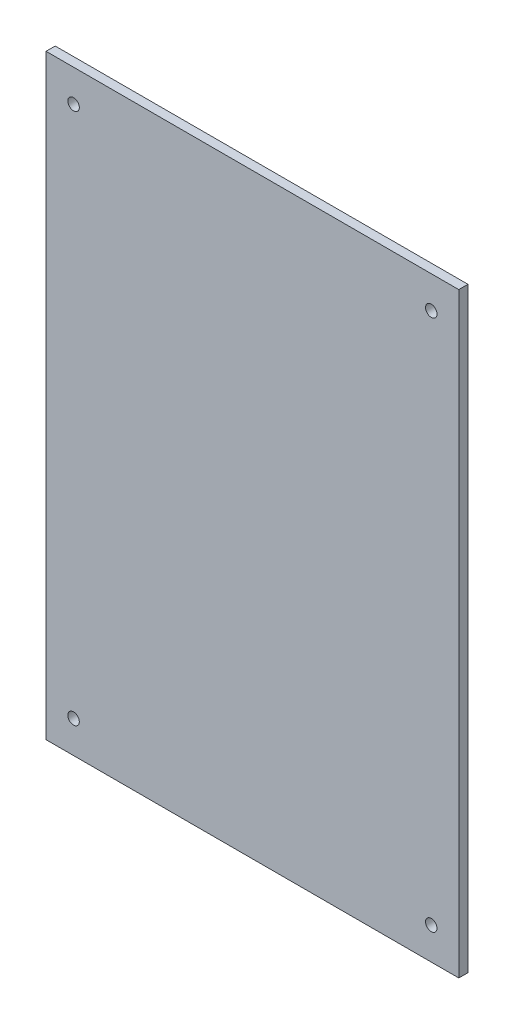
ISO-10303-21;
HEADER;
FILE_DESCRIPTION(('STEP AP214'),'2;1');
FILE_NAME('part.step','',(''),(''),'','','');
FILE_SCHEMA(('AUTOMOTIVE_DESIGN { 1 0 10303 214 1 1 1 1 }'));
ENDSEC;
DATA;
#1=APPLICATION_CONTEXT('core data for automotive mechanical design processes');
#2=APPLICATION_PROTOCOL_DEFINITION('international standard','automotive_design',2000,#1);
#3=PRODUCT_CONTEXT('',#1,'mechanical');
#4=PRODUCT('Part','Part','',(#3));
#5=PRODUCT_RELATED_PRODUCT_CATEGORY('part','',(#4));
#6=PRODUCT_DEFINITION_FORMATION('','',#4);
#7=PRODUCT_DEFINITION_CONTEXT('part definition',#1,'design');
#8=PRODUCT_DEFINITION('design','',#6,#7);
#9=PRODUCT_DEFINITION_SHAPE('','',#8);
#10=(LENGTH_UNIT() NAMED_UNIT(*) SI_UNIT(.MILLI.,.METRE.));
#11=(NAMED_UNIT(*) PLANE_ANGLE_UNIT() SI_UNIT($,.RADIAN.));
#12=(NAMED_UNIT(*) SI_UNIT($,.STERADIAN.) SOLID_ANGLE_UNIT());
#13=UNCERTAINTY_MEASURE_WITH_UNIT(LENGTH_MEASURE(1.E-05),#10,'distance_accuracy_value','');
#14=(GEOMETRIC_REPRESENTATION_CONTEXT(3) GLOBAL_UNCERTAINTY_ASSIGNED_CONTEXT((#13)) GLOBAL_UNIT_ASSIGNED_CONTEXT((#10,
#11,#12)) REPRESENTATION_CONTEXT('',''));
#15=CARTESIAN_POINT('',(0.,0.,0.));
#16=DIRECTION('',(0.,0.,1.));
#17=DIRECTION('',(1.,0.,0.));
#18=AXIS2_PLACEMENT_3D('',#15,#16,#17);
#19=CARTESIAN_POINT('',(0.,0.,4.));
#20=DIRECTION('',(0.,0.,-1.));
#21=DIRECTION('',(-1.,0.,0.));
#22=AXIS2_PLACEMENT_3D('',#19,#20,#21);
#23=PLANE('',#22);
#24=DIRECTION('',(0.,-1.,0.));
#25=VECTOR('',#24,1.);
#26=CARTESIAN_POINT('',(0.,0.,4.));
#27=LINE('',#26,#25);
#28=CARTESIAN_POINT('',(0.,260.,4.));
#29=VERTEX_POINT('',#28);
#30=CARTESIAN_POINT('',(0.,0.,4.));
#31=VERTEX_POINT('',#30);
#32=EDGE_CURVE('E94',#29,#31,#27,.T.);
#33=ORIENTED_EDGE('',*,*,#32,.T.);
#34=DIRECTION('',(1.,0.,0.));
#35=VECTOR('',#34,1.);
#36=CARTESIAN_POINT('',(0.,0.,4.));
#37=LINE('',#36,#35);
#38=CARTESIAN_POINT('',(180.,0.,4.));
#39=VERTEX_POINT('',#38);
#40=EDGE_CURVE('E89',#31,#39,#37,.T.);
#41=ORIENTED_EDGE('',*,*,#40,.T.);
#42=DIRECTION('',(0.,1.,0.));
#43=VECTOR('',#42,1.);
#44=CARTESIAN_POINT('',(180.,0.,4.));
#45=LINE('',#44,#43);
#46=CARTESIAN_POINT('',(180.,260.,4.));
#47=VERTEX_POINT('',#46);
#48=EDGE_CURVE('E93',#39,#47,#45,.T.);
#49=ORIENTED_EDGE('',*,*,#48,.T.);
#50=DIRECTION('',(-1.,0.,0.));
#51=VECTOR('',#50,1.);
#52=CARTESIAN_POINT('',(0.,260.,4.));
#53=LINE('',#52,#51);
#54=EDGE_CURVE('E58',#47,#29,#53,.T.);
#55=ORIENTED_EDGE('',*,*,#54,.T.);
#56=EDGE_LOOP('',(#33,#41,#49,#55));
#57=FACE_BOUND('',#56,.T.);
#58=CARTESIAN_POINT('',(12.,14.,4.));
#59=DIRECTION('',(0.,0.,1.));
#60=DIRECTION('',(1.,0.,0.));
#61=AXIS2_PLACEMENT_3D('',#58,#59,#60);
#62=CIRCLE('',#61,2.5);
#63=CARTESIAN_POINT('',(14.5,14.,4.));
#64=VERTEX_POINT('',#63);
#65=EDGE_CURVE('E109',#64,#64,#62,.T.);
#66=ORIENTED_EDGE('',*,*,#65,.F.);
#67=EDGE_LOOP('',(#66));
#68=FACE_BOUND('',#67,.T.);
#69=CARTESIAN_POINT('',(12.,246.,4.));
#70=DIRECTION('',(0.,0.,1.));
#71=DIRECTION('',(1.,0.,0.));
#72=AXIS2_PLACEMENT_3D('',#69,#70,#71);
#73=CIRCLE('',#72,2.5);
#74=CARTESIAN_POINT('',(14.5,246.,4.));
#75=VERTEX_POINT('',#74);
#76=EDGE_CURVE('E124',#75,#75,#73,.T.);
#77=ORIENTED_EDGE('',*,*,#76,.F.);
#78=EDGE_LOOP('',(#77));
#79=FACE_BOUND('',#78,.T.);
#80=CARTESIAN_POINT('',(168.,14.,4.));
#81=DIRECTION('',(0.,0.,1.));
#82=DIRECTION('',(1.,0.,0.));
#83=AXIS2_PLACEMENT_3D('',#80,#81,#82);
#84=CIRCLE('',#83,2.5);
#85=CARTESIAN_POINT('',(170.5,14.,4.));
#86=VERTEX_POINT('',#85);
#87=EDGE_CURVE('E131',#86,#86,#84,.T.);
#88=ORIENTED_EDGE('',*,*,#87,.F.);
#89=EDGE_LOOP('',(#88));
#90=FACE_BOUND('',#89,.T.);
#91=CARTESIAN_POINT('',(168.,246.,4.));
#92=DIRECTION('',(0.,0.,1.));
#93=DIRECTION('',(1.,0.,0.));
#94=AXIS2_PLACEMENT_3D('',#91,#92,#93);
#95=CIRCLE('',#94,2.5);
#96=CARTESIAN_POINT('',(170.5,246.,4.));
#97=VERTEX_POINT('',#96);
#98=EDGE_CURVE('E140',#97,#97,#95,.T.);
#99=ORIENTED_EDGE('',*,*,#98,.F.);
#100=EDGE_LOOP('',(#99));
#101=FACE_BOUND('',#100,.T.);
#102=ADVANCED_FACE('F43',(#57,#68,#79,#90,#101),#23,.F.);
#103=CARTESIAN_POINT('',(0.,0.,0.));
#104=DIRECTION('',(0.,0.,-1.));
#105=DIRECTION('',(-1.,0.,0.));
#106=AXIS2_PLACEMENT_3D('',#103,#104,#105);
#107=PLANE('',#106);
#108=CARTESIAN_POINT('',(168.,14.,0.));
#109=DIRECTION('',(0.,0.,1.));
#110=DIRECTION('',(1.,0.,0.));
#111=AXIS2_PLACEMENT_3D('',#108,#109,#110);
#112=CIRCLE('',#111,2.5);
#113=CARTESIAN_POINT('',(170.5,14.,0.));
#114=VERTEX_POINT('',#113);
#115=EDGE_CURVE('E132',#114,#114,#112,.T.);
#116=ORIENTED_EDGE('',*,*,#115,.T.);
#117=EDGE_LOOP('',(#116));
#118=FACE_BOUND('',#117,.T.);
#119=CARTESIAN_POINT('',(12.,14.,0.));
#120=DIRECTION('',(0.,0.,1.));
#121=DIRECTION('',(1.,0.,0.));
#122=AXIS2_PLACEMENT_3D('',#119,#120,#121);
#123=CIRCLE('',#122,2.5);
#124=CARTESIAN_POINT('',(14.5,14.,0.));
#125=VERTEX_POINT('',#124);
#126=EDGE_CURVE('E122',#125,#125,#123,.T.);
#127=ORIENTED_EDGE('',*,*,#126,.T.);
#128=EDGE_LOOP('',(#127));
#129=FACE_BOUND('',#128,.T.);
#130=DIRECTION('',(0.,-1.,0.));
#131=VECTOR('',#130,1.);
#132=CARTESIAN_POINT('',(0.,0.,0.));
#133=LINE('',#132,#131);
#134=CARTESIAN_POINT('',(0.,260.,0.));
#135=VERTEX_POINT('',#134);
#136=CARTESIAN_POINT('',(0.,0.,0.));
#137=VERTEX_POINT('',#136);
#138=EDGE_CURVE('E110',#135,#137,#133,.T.);
#139=ORIENTED_EDGE('',*,*,#138,.F.);
#140=DIRECTION('',(-1.,0.,0.));
#141=VECTOR('',#140,1.);
#142=CARTESIAN_POINT('',(0.,260.,0.));
#143=LINE('',#142,#141);
#144=CARTESIAN_POINT('',(180.,260.,0.));
#145=VERTEX_POINT('',#144);
#146=EDGE_CURVE('E81',#145,#135,#143,.T.);
#147=ORIENTED_EDGE('',*,*,#146,.F.);
#148=DIRECTION('',(0.,1.,0.));
#149=VECTOR('',#148,1.);
#150=CARTESIAN_POINT('',(180.,0.,0.));
#151=LINE('',#150,#149);
#152=CARTESIAN_POINT('',(180.,0.,0.));
#153=VERTEX_POINT('',#152);
#154=EDGE_CURVE('E77',#153,#145,#151,.T.);
#155=ORIENTED_EDGE('',*,*,#154,.F.);
#156=DIRECTION('',(1.,0.,0.));
#157=VECTOR('',#156,1.);
#158=CARTESIAN_POINT('',(0.,0.,0.));
#159=LINE('',#158,#157);
#160=EDGE_CURVE('E98',#137,#153,#159,.T.);
#161=ORIENTED_EDGE('',*,*,#160,.F.);
#162=EDGE_LOOP('',(#139,#147,#155,#161));
#163=FACE_BOUND('',#162,.T.);
#164=CARTESIAN_POINT('',(12.,246.,0.));
#165=DIRECTION('',(0.,0.,1.));
#166=DIRECTION('',(1.,0.,0.));
#167=AXIS2_PLACEMENT_3D('',#164,#165,#166);
#168=CIRCLE('',#167,2.5);
#169=CARTESIAN_POINT('',(14.5,246.,0.));
#170=VERTEX_POINT('',#169);
#171=EDGE_CURVE('E126',#170,#170,#168,.T.);
#172=ORIENTED_EDGE('',*,*,#171,.T.);
#173=EDGE_LOOP('',(#172));
#174=FACE_BOUND('',#173,.T.);
#175=CARTESIAN_POINT('',(168.,246.,0.));
#176=DIRECTION('',(0.,0.,1.));
#177=DIRECTION('',(1.,0.,0.));
#178=AXIS2_PLACEMENT_3D('',#175,#176,#177);
#179=CIRCLE('',#178,2.5);
#180=CARTESIAN_POINT('',(170.5,246.,0.));
#181=VERTEX_POINT('',#180);
#182=EDGE_CURVE('E139',#181,#181,#179,.T.);
#183=ORIENTED_EDGE('',*,*,#182,.T.);
#184=EDGE_LOOP('',(#183));
#185=FACE_BOUND('',#184,.T.);
#186=ADVANCED_FACE('F116',(#118,#129,#163,#174,#185),#107,.T.);
#187=CARTESIAN_POINT('',(0.,0.,4.));
#188=DIRECTION('',(1.,0.,0.));
#189=DIRECTION('',(0.,0.,-1.));
#190=AXIS2_PLACEMENT_3D('',#187,#188,#189);
#191=PLANE('',#190);
#192=ORIENTED_EDGE('',*,*,#138,.T.);
#193=DIRECTION('',(0.,0.,-1.));
#194=VECTOR('',#193,1.);
#195=CARTESIAN_POINT('',(0.,0.,4.));
#196=LINE('',#195,#194);
#197=EDGE_CURVE('E11',#31,#137,#196,.T.);
#198=ORIENTED_EDGE('',*,*,#197,.F.);
#199=ORIENTED_EDGE('',*,*,#32,.F.);
#200=DIRECTION('',(0.,0.,-1.));
#201=VECTOR('',#200,1.);
#202=CARTESIAN_POINT('',(0.,260.,4.));
#203=LINE('',#202,#201);
#204=EDGE_CURVE('E104',#29,#135,#203,.T.);
#205=ORIENTED_EDGE('',*,*,#204,.T.);
#206=EDGE_LOOP('',(#192,#198,#199,#205));
#207=FACE_BOUND('',#206,.T.);
#208=ADVANCED_FACE('F44',(#207),#191,.F.);
#209=CARTESIAN_POINT('',(0.,0.,4.));
#210=DIRECTION('',(0.,1.,0.));
#211=DIRECTION('',(0.,0.,1.));
#212=AXIS2_PLACEMENT_3D('',#209,#210,#211);
#213=PLANE('',#212);
#214=ORIENTED_EDGE('',*,*,#160,.T.);
#215=DIRECTION('',(0.,0.,-1.));
#216=VECTOR('',#215,1.);
#217=CARTESIAN_POINT('',(180.,0.,4.));
#218=LINE('',#217,#216);
#219=EDGE_CURVE('E55',#39,#153,#218,.T.);
#220=ORIENTED_EDGE('',*,*,#219,.F.);
#221=ORIENTED_EDGE('',*,*,#40,.F.);
#222=ORIENTED_EDGE('',*,*,#197,.T.);
#223=EDGE_LOOP('',(#214,#220,#221,#222));
#224=FACE_BOUND('',#223,.T.);
#225=ADVANCED_FACE('F97',(#224),#213,.F.);
#226=CARTESIAN_POINT('',(180.,0.,4.));
#227=DIRECTION('',(-1.,0.,0.));
#228=DIRECTION('',(0.,0.,1.));
#229=AXIS2_PLACEMENT_3D('',#226,#227,#228);
#230=PLANE('',#229);
#231=ORIENTED_EDGE('',*,*,#154,.T.);
#232=DIRECTION('',(0.,0.,-1.));
#233=VECTOR('',#232,1.);
#234=CARTESIAN_POINT('',(180.,260.,4.));
#235=LINE('',#234,#233);
#236=EDGE_CURVE('E99',#47,#145,#235,.T.);
#237=ORIENTED_EDGE('',*,*,#236,.F.);
#238=ORIENTED_EDGE('',*,*,#48,.F.);
#239=ORIENTED_EDGE('',*,*,#219,.T.);
#240=EDGE_LOOP('',(#231,#237,#238,#239));
#241=FACE_BOUND('',#240,.T.);
#242=ADVANCED_FACE('F102',(#241),#230,.F.);
#243=CARTESIAN_POINT('',(0.,260.,4.));
#244=DIRECTION('',(0.,-1.,0.));
#245=DIRECTION('',(0.,0.,-1.));
#246=AXIS2_PLACEMENT_3D('',#243,#244,#245);
#247=PLANE('',#246);
#248=ORIENTED_EDGE('',*,*,#146,.T.);
#249=ORIENTED_EDGE('',*,*,#204,.F.);
#250=ORIENTED_EDGE('',*,*,#54,.F.);
#251=ORIENTED_EDGE('',*,*,#236,.T.);
#252=EDGE_LOOP('',(#248,#249,#250,#251));
#253=FACE_BOUND('',#252,.T.);
#254=ADVANCED_FACE('F113',(#253),#247,.F.);
#255=CARTESIAN_POINT('',(12.,14.,4.));
#256=DIRECTION('',(0.,0.,-1.));
#257=DIRECTION('',(-1.,0.,0.));
#258=AXIS2_PLACEMENT_3D('',#255,#256,#257);
#259=CYLINDRICAL_SURFACE('',#258,2.5);
#260=ORIENTED_EDGE('',*,*,#65,.T.);
#261=EDGE_LOOP('',(#260));
#262=FACE_BOUND('',#261,.T.);
#263=ORIENTED_EDGE('',*,*,#126,.F.);
#264=EDGE_LOOP('',(#263));
#265=FACE_BOUND('',#264,.T.);
#266=ADVANCED_FACE('F160',(#262,#265),#259,.F.);
#267=CARTESIAN_POINT('',(12.,246.,4.));
#268=DIRECTION('',(0.,0.,-1.));
#269=DIRECTION('',(-1.,0.,0.));
#270=AXIS2_PLACEMENT_3D('',#267,#268,#269);
#271=CYLINDRICAL_SURFACE('',#270,2.5);
#272=ORIENTED_EDGE('',*,*,#76,.T.);
#273=EDGE_LOOP('',(#272));
#274=FACE_BOUND('',#273,.T.);
#275=ORIENTED_EDGE('',*,*,#171,.F.);
#276=EDGE_LOOP('',(#275));
#277=FACE_BOUND('',#276,.T.);
#278=ADVANCED_FACE('F205',(#274,#277),#271,.F.);
#279=CARTESIAN_POINT('',(168.,14.,4.));
#280=DIRECTION('',(0.,0.,-1.));
#281=DIRECTION('',(-1.,0.,0.));
#282=AXIS2_PLACEMENT_3D('',#279,#280,#281);
#283=CYLINDRICAL_SURFACE('',#282,2.5);
#284=ORIENTED_EDGE('',*,*,#87,.T.);
#285=EDGE_LOOP('',(#284));
#286=FACE_BOUND('',#285,.T.);
#287=ORIENTED_EDGE('',*,*,#115,.F.);
#288=EDGE_LOOP('',(#287));
#289=FACE_BOUND('',#288,.T.);
#290=ADVANCED_FACE('F209',(#286,#289),#283,.F.);
#291=CARTESIAN_POINT('',(168.,246.,4.));
#292=DIRECTION('',(0.,0.,-1.));
#293=DIRECTION('',(-1.,0.,0.));
#294=AXIS2_PLACEMENT_3D('',#291,#292,#293);
#295=CYLINDRICAL_SURFACE('',#294,2.5);
#296=ORIENTED_EDGE('',*,*,#98,.T.);
#297=EDGE_LOOP('',(#296));
#298=FACE_BOUND('',#297,.T.);
#299=ORIENTED_EDGE('',*,*,#182,.F.);
#300=EDGE_LOOP('',(#299));
#301=FACE_BOUND('',#300,.T.);
#302=ADVANCED_FACE('F147',(#298,#301),#295,.F.);
#303=CLOSED_SHELL('',(#102,#186,#208,#225,#242,#254,#266,#278,#290,#302));
#304=MANIFOLD_SOLID_BREP('B2',#303);
#305=ADVANCED_BREP_SHAPE_REPRESENTATION('',(#18,#304),#14);
#306=SHAPE_DEFINITION_REPRESENTATION(#9,#305);
ENDSEC;
END-ISO-10303-21;
